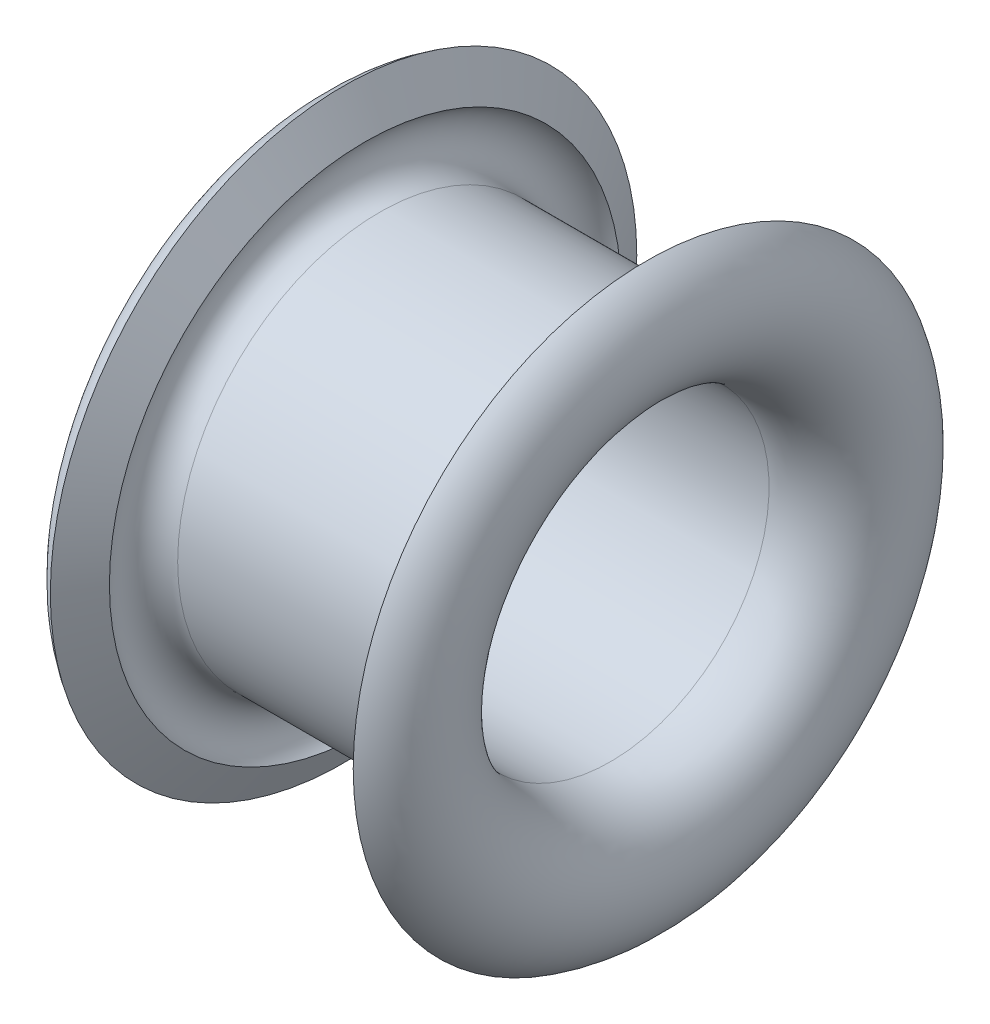
ISO-10303-21;
HEADER;
FILE_DESCRIPTION(('STEP AP214'),'2;1');
FILE_NAME('part.step','',(''),(''),'','','');
FILE_SCHEMA(('AUTOMOTIVE_DESIGN { 1 0 10303 214 1 1 1 1 }'));
ENDSEC;
DATA;
#1=APPLICATION_CONTEXT('core data for automotive mechanical design processes');
#2=APPLICATION_PROTOCOL_DEFINITION('international standard','automotive_design',2000,#1);
#3=PRODUCT_CONTEXT('',#1,'mechanical');
#4=PRODUCT('Part','Part','',(#3));
#5=PRODUCT_RELATED_PRODUCT_CATEGORY('part','',(#4));
#6=PRODUCT_DEFINITION_FORMATION('','',#4);
#7=PRODUCT_DEFINITION_CONTEXT('part definition',#1,'design');
#8=PRODUCT_DEFINITION('design','',#6,#7);
#9=PRODUCT_DEFINITION_SHAPE('','',#8);
#10=(LENGTH_UNIT() NAMED_UNIT(*) SI_UNIT(.MILLI.,.METRE.));
#11=(NAMED_UNIT(*) PLANE_ANGLE_UNIT() SI_UNIT($,.RADIAN.));
#12=(NAMED_UNIT(*) SI_UNIT($,.STERADIAN.) SOLID_ANGLE_UNIT());
#13=UNCERTAINTY_MEASURE_WITH_UNIT(LENGTH_MEASURE(1.E-05),#10,'distance_accuracy_value','');
#14=(GEOMETRIC_REPRESENTATION_CONTEXT(3) GLOBAL_UNCERTAINTY_ASSIGNED_CONTEXT((#13)) GLOBAL_UNIT_ASSIGNED_CONTEXT((#10,
#11,#12)) REPRESENTATION_CONTEXT('',''));
#15=CARTESIAN_POINT('',(0.,0.,0.));
#16=DIRECTION('',(0.,0.,1.));
#17=DIRECTION('',(1.,0.,0.));
#18=AXIS2_PLACEMENT_3D('',#15,#16,#17);
#19=CARTESIAN_POINT('',(0.,0.,0.));
#20=DIRECTION('',(-1.,0.,0.));
#21=DIRECTION('',(0.,0.,1.));
#22=AXIS2_PLACEMENT_3D('',#19,#20,#21);
#23=CYLINDRICAL_SURFACE('',#22,1.1);
#24=CARTESIAN_POINT('',(0.8,0.,0.));
#25=DIRECTION('',(-1.,0.,0.));
#26=DIRECTION('',(0.,0.,1.));
#27=AXIS2_PLACEMENT_3D('',#24,#25,#26);
#28=CIRCLE('',#27,1.1);
#29=CARTESIAN_POINT('',(0.8,0.,1.1));
#30=VERTEX_POINT('',#29);
#31=EDGE_CURVE('E10',#30,#30,#28,.T.);
#32=ORIENTED_EDGE('',*,*,#31,.F.);
#33=EDGE_LOOP('',(#32));
#34=FACE_BOUND('',#33,.T.);
#35=CARTESIAN_POINT('',(-0.8,0.,0.));
#36=DIRECTION('',(-1.,0.,0.));
#37=DIRECTION('',(0.,0.,1.));
#38=AXIS2_PLACEMENT_3D('',#35,#36,#37);
#39=CIRCLE('',#38,1.1);
#40=CARTESIAN_POINT('',(-0.8,0.,1.1));
#41=VERTEX_POINT('',#40);
#42=EDGE_CURVE('E53',#41,#41,#39,.T.);
#43=ORIENTED_EDGE('',*,*,#42,.T.);
#44=EDGE_LOOP('',(#43));
#45=FACE_BOUND('',#44,.T.);
#46=ADVANCED_FACE('F34',(#34,#45),#23,.F.);
#47=CARTESIAN_POINT('',(0.8,0.,0.));
#48=DIRECTION('',(-1.,0.,0.));
#49=DIRECTION('',(0.,0.,1.));
#50=AXIS2_PLACEMENT_3D('',#47,#48,#49);
#51=TOROIDAL_SURFACE('',#50,1.6,0.5);
#52=CARTESIAN_POINT('',(1.05,0.,0.));
#53=DIRECTION('',(-1.,0.,0.));
#54=DIRECTION('',(0.,0.,1.));
#55=AXIS2_PLACEMENT_3D('',#52,#53,#54);
#56=CIRCLE('',#55,2.03301270189222);
#57=CARTESIAN_POINT('',(1.05,0.,2.03301270189222));
#58=VERTEX_POINT('',#57);
#59=EDGE_CURVE('E40',#58,#58,#56,.T.);
#60=ORIENTED_EDGE('',*,*,#59,.F.);
#61=EDGE_LOOP('',(#60));
#62=FACE_BOUND('',#61,.T.);
#63=ORIENTED_EDGE('',*,*,#31,.T.);
#64=EDGE_LOOP('',(#63));
#65=FACE_BOUND('',#64,.T.);
#66=ADVANCED_FACE('F86',(#62,#65),#51,.T.);
#67=CARTESIAN_POINT('',(1.05,0.,0.));
#68=DIRECTION('',(1.,0.,0.));
#69=DIRECTION('',(0.,0.,-1.));
#70=AXIS2_PLACEMENT_3D('',#67,#68,#69);
#71=CONICAL_SURFACE('',#70,2.03301270189222,1.0471975511966);
#72=CARTESIAN_POINT('',(0.9,0.,0.));
#73=DIRECTION('',(-1.,0.,0.));
#74=DIRECTION('',(0.,0.,1.));
#75=AXIS2_PLACEMENT_3D('',#72,#73,#74);
#76=CIRCLE('',#75,1.77320508075689);
#77=CARTESIAN_POINT('',(0.9,0.,1.77320508075689));
#78=VERTEX_POINT('',#77);
#79=EDGE_CURVE('E44',#78,#78,#76,.T.);
#80=ORIENTED_EDGE('',*,*,#79,.F.);
#81=EDGE_LOOP('',(#80));
#82=FACE_BOUND('',#81,.T.);
#83=ORIENTED_EDGE('',*,*,#59,.T.);
#84=EDGE_LOOP('',(#83));
#85=FACE_BOUND('',#84,.T.);
#86=ADVANCED_FACE('F82',(#82,#85),#71,.T.);
#87=CARTESIAN_POINT('',(0.8,0.,0.));
#88=DIRECTION('',(-1.,0.,0.));
#89=DIRECTION('',(0.,0.,1.));
#90=AXIS2_PLACEMENT_3D('',#87,#88,#89);
#91=TOROIDAL_SURFACE('',#90,1.6,0.2);
#92=CARTESIAN_POINT('',(0.8,0.,0.));
#93=DIRECTION('',(-1.,0.,0.));
#94=DIRECTION('',(0.,0.,1.));
#95=AXIS2_PLACEMENT_3D('',#92,#93,#94);
#96=CIRCLE('',#95,1.4);
#97=CARTESIAN_POINT('',(0.8,0.,1.4));
#98=VERTEX_POINT('',#97);
#99=EDGE_CURVE('E48',#98,#98,#96,.T.);
#100=ORIENTED_EDGE('',*,*,#99,.F.);
#101=EDGE_LOOP('',(#100));
#102=FACE_BOUND('',#101,.T.);
#103=ORIENTED_EDGE('',*,*,#79,.T.);
#104=EDGE_LOOP('',(#103));
#105=FACE_BOUND('',#104,.T.);
#106=ADVANCED_FACE('F72',(#102,#105),#91,.F.);
#107=CARTESIAN_POINT('',(0.,0.,0.));
#108=DIRECTION('',(-1.,0.,0.));
#109=DIRECTION('',(0.,0.,1.));
#110=AXIS2_PLACEMENT_3D('',#107,#108,#109);
#111=CYLINDRICAL_SURFACE('',#110,1.4);
#112=ORIENTED_EDGE('',*,*,#99,.T.);
#113=EDGE_LOOP('',(#112));
#114=FACE_BOUND('',#113,.T.);
#115=CARTESIAN_POINT('',(-0.8,0.,0.));
#116=DIRECTION('',(-1.,0.,0.));
#117=DIRECTION('',(0.,0.,1.));
#118=AXIS2_PLACEMENT_3D('',#115,#116,#117);
#119=CIRCLE('',#118,1.4);
#120=CARTESIAN_POINT('',(-0.8,0.,1.4));
#121=VERTEX_POINT('',#120);
#122=EDGE_CURVE('E62',#121,#121,#119,.T.);
#123=ORIENTED_EDGE('',*,*,#122,.F.);
#124=EDGE_LOOP('',(#123));
#125=FACE_BOUND('',#124,.T.);
#126=ADVANCED_FACE('F69',(#114,#125),#111,.T.);
#127=CARTESIAN_POINT('',(-0.8,0.,0.));
#128=DIRECTION('',(1.,0.,0.));
#129=DIRECTION('',(0.,0.,1.));
#130=AXIS2_PLACEMENT_3D('',#127,#128,#129);
#131=TOROIDAL_SURFACE('',#130,1.6,0.5);
#132=CARTESIAN_POINT('',(-1.05,0.,0.));
#133=DIRECTION('',(-1.,0.,0.));
#134=DIRECTION('',(0.,0.,1.));
#135=AXIS2_PLACEMENT_3D('',#132,#133,#134);
#136=CIRCLE('',#135,2.03301270189222);
#137=CARTESIAN_POINT('',(-1.05,0.,2.03301270189222));
#138=VERTEX_POINT('',#137);
#139=EDGE_CURVE('E56',#138,#138,#136,.T.);
#140=ORIENTED_EDGE('',*,*,#139,.T.);
#141=EDGE_LOOP('',(#140));
#142=FACE_BOUND('',#141,.T.);
#143=ORIENTED_EDGE('',*,*,#42,.F.);
#144=EDGE_LOOP('',(#143));
#145=FACE_BOUND('',#144,.T.);
#146=ADVANCED_FACE('F71',(#142,#145),#131,.T.);
#147=CARTESIAN_POINT('',(-1.05,0.,0.));
#148=DIRECTION('',(-1.,0.,0.));
#149=DIRECTION('',(0.,0.,-1.));
#150=AXIS2_PLACEMENT_3D('',#147,#148,#149);
#151=CONICAL_SURFACE('',#150,2.03301270189222,1.0471975511966);
#152=CARTESIAN_POINT('',(-0.9,0.,0.));
#153=DIRECTION('',(-1.,0.,0.));
#154=DIRECTION('',(0.,0.,1.));
#155=AXIS2_PLACEMENT_3D('',#152,#153,#154);
#156=CIRCLE('',#155,1.77320508075689);
#157=CARTESIAN_POINT('',(-0.9,0.,1.77320508075689));
#158=VERTEX_POINT('',#157);
#159=EDGE_CURVE('E59',#158,#158,#156,.T.);
#160=ORIENTED_EDGE('',*,*,#159,.T.);
#161=EDGE_LOOP('',(#160));
#162=FACE_BOUND('',#161,.T.);
#163=ORIENTED_EDGE('',*,*,#139,.F.);
#164=EDGE_LOOP('',(#163));
#165=FACE_BOUND('',#164,.T.);
#166=ADVANCED_FACE('F79',(#162,#165),#151,.T.);
#167=CARTESIAN_POINT('',(-0.8,0.,0.));
#168=DIRECTION('',(1.,0.,0.));
#169=DIRECTION('',(0.,0.,1.));
#170=AXIS2_PLACEMENT_3D('',#167,#168,#169);
#171=TOROIDAL_SURFACE('',#170,1.6,0.2);
#172=ORIENTED_EDGE('',*,*,#122,.T.);
#173=EDGE_LOOP('',(#172));
#174=FACE_BOUND('',#173,.T.);
#175=ORIENTED_EDGE('',*,*,#159,.F.);
#176=EDGE_LOOP('',(#175));
#177=FACE_BOUND('',#176,.T.);
#178=ADVANCED_FACE('F66',(#174,#177),#171,.F.);
#179=CLOSED_SHELL('',(#46,#66,#86,#106,#126,#146,#166,#178));
#180=MANIFOLD_SOLID_BREP('B2',#179);
#181=ADVANCED_BREP_SHAPE_REPRESENTATION('',(#18,#180),#14);
#182=SHAPE_DEFINITION_REPRESENTATION(#9,#181);
ENDSEC;
END-ISO-10303-21;
